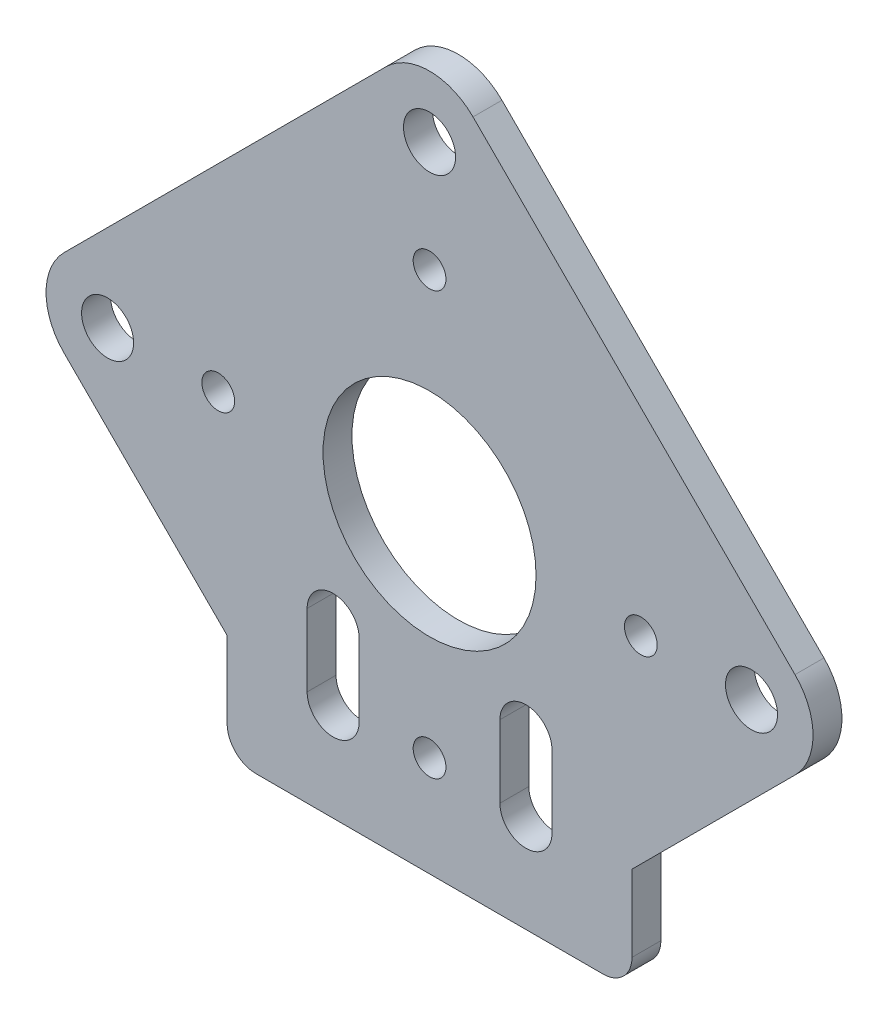
ISO-10303-21;
HEADER;
FILE_DESCRIPTION(('STEP AP214'),'2;1');
FILE_NAME('part.step','',(''),(''),'','','');
FILE_SCHEMA(('AUTOMOTIVE_DESIGN { 1 0 10303 214 1 1 1 1 }'));
ENDSEC;
DATA;
#1=APPLICATION_CONTEXT('core data for automotive mechanical design processes');
#2=APPLICATION_PROTOCOL_DEFINITION('international standard','automotive_design',2000,#1);
#3=PRODUCT_CONTEXT('',#1,'mechanical');
#4=PRODUCT('Part','Part','',(#3));
#5=PRODUCT_RELATED_PRODUCT_CATEGORY('part','',(#4));
#6=PRODUCT_DEFINITION_FORMATION('','',#4);
#7=PRODUCT_DEFINITION_CONTEXT('part definition',#1,'design');
#8=PRODUCT_DEFINITION('design','',#6,#7);
#9=PRODUCT_DEFINITION_SHAPE('','',#8);
#10=(LENGTH_UNIT() NAMED_UNIT(*) SI_UNIT(.MILLI.,.METRE.));
#11=(NAMED_UNIT(*) PLANE_ANGLE_UNIT() SI_UNIT($,.RADIAN.));
#12=(NAMED_UNIT(*) SI_UNIT($,.STERADIAN.) SOLID_ANGLE_UNIT());
#13=UNCERTAINTY_MEASURE_WITH_UNIT(LENGTH_MEASURE(1.E-05),#10,'distance_accuracy_value','');
#14=(GEOMETRIC_REPRESENTATION_CONTEXT(3) GLOBAL_UNCERTAINTY_ASSIGNED_CONTEXT((#13)) GLOBAL_UNIT_ASSIGNED_CONTEXT((#10,
#11,#12)) REPRESENTATION_CONTEXT('',''));
#15=CARTESIAN_POINT('',(0.,0.,0.));
#16=DIRECTION('',(0.,0.,1.));
#17=DIRECTION('',(1.,0.,0.));
#18=AXIS2_PLACEMENT_3D('',#15,#16,#17);
#19=CARTESIAN_POINT('',(73.4037243432525,32.3499999286518,3.));
#20=DIRECTION('',(0.,0.,1.));
#21=DIRECTION('',(1.,0.,0.));
#22=AXIS2_PLACEMENT_3D('',#19,#20,#21);
#23=PLANE('',#22);
#24=DIRECTION('',(0.,-1.,0.));
#25=VECTOR('',#24,1.);
#26=CARTESIAN_POINT('',(27.3,17.5,3.));
#27=LINE('',#26,#25);
#28=CARTESIAN_POINT('',(27.3,17.5,3.));
#29=VERTEX_POINT('',#28);
#30=CARTESIAN_POINT('',(27.3,10.,3.));
#31=VERTEX_POINT('',#30);
#32=EDGE_CURVE('E208',#29,#31,#27,.T.);
#33=ORIENTED_EDGE('',*,*,#32,.F.);
#34=CARTESIAN_POINT('',(30.,17.5,3.));
#35=DIRECTION('',(0.,0.,1.));
#36=DIRECTION('',(1.,0.,0.));
#37=AXIS2_PLACEMENT_3D('',#34,#35,#36);
#38=CIRCLE('',#37,2.7);
#39=CARTESIAN_POINT('',(32.7,17.5,3.));
#40=VERTEX_POINT('',#39);
#41=EDGE_CURVE('E206',#40,#29,#38,.T.);
#42=ORIENTED_EDGE('',*,*,#41,.F.);
#43=DIRECTION('',(0.,1.,0.));
#44=VECTOR('',#43,1.);
#45=CARTESIAN_POINT('',(32.7,10.,3.));
#46=LINE('',#45,#44);
#47=CARTESIAN_POINT('',(32.7,10.,3.));
#48=VERTEX_POINT('',#47);
#49=EDGE_CURVE('E214',#48,#40,#46,.T.);
#50=ORIENTED_EDGE('',*,*,#49,.F.);
#51=CARTESIAN_POINT('',(30.,10.,3.));
#52=DIRECTION('',(0.,0.,1.));
#53=DIRECTION('',(1.,0.,0.));
#54=AXIS2_PLACEMENT_3D('',#51,#52,#53);
#55=CIRCLE('',#54,2.7);
#56=EDGE_CURVE('E211',#31,#48,#55,.T.);
#57=ORIENTED_EDGE('',*,*,#56,.F.);
#58=EDGE_LOOP('',(#33,#42,#50,#57));
#59=FACE_BOUND('',#58,.T.);
#60=CARTESIAN_POINT('',(40.,65.75,3.));
#61=DIRECTION('',(0.,0.,1.));
#62=DIRECTION('',(1.,0.,0.));
#63=AXIS2_PLACEMENT_3D('',#60,#61,#62);
#64=CIRCLE('',#63,2.7);
#65=CARTESIAN_POINT('',(42.7,65.75,3.));
#66=VERTEX_POINT('',#65);
#67=EDGE_CURVE('E243',#66,#66,#64,.T.);
#68=ORIENTED_EDGE('',*,*,#67,.F.);
#69=EDGE_LOOP('',(#68));
#70=FACE_BOUND('',#69,.T.);
#71=CARTESIAN_POINT('',(40.,32.35,3.));
#72=DIRECTION('',(0.,0.,1.));
#73=DIRECTION('',(1.,0.,0.));
#74=AXIS2_PLACEMENT_3D('',#71,#72,#73);
#75=CIRCLE('',#74,11.05);
#76=CARTESIAN_POINT('',(51.05,32.35,3.));
#77=VERTEX_POINT('',#76);
#78=EDGE_CURVE('E255',#77,#77,#75,.T.);
#79=ORIENTED_EDGE('',*,*,#78,.F.);
#80=EDGE_LOOP('',(#79));
#81=FACE_BOUND('',#80,.T.);
#82=CARTESIAN_POINT('',(40.,54.270310216783,3.));
#83=DIRECTION('',(0.,0.,1.));
#84=DIRECTION('',(1.,0.,0.));
#85=AXIS2_PLACEMENT_3D('',#82,#83,#84);
#86=CIRCLE('',#85,1.7);
#87=CARTESIAN_POINT('',(41.7,54.270310216783,3.));
#88=VERTEX_POINT('',#87);
#89=EDGE_CURVE('E267',#88,#88,#86,.T.);
#90=ORIENTED_EDGE('',*,*,#89,.F.);
#91=EDGE_LOOP('',(#90));
#92=FACE_BOUND('',#91,.T.);
#93=CARTESIAN_POINT('',(40.,10.429689783217,3.));
#94=DIRECTION('',(0.,0.,1.));
#95=DIRECTION('',(1.,0.,0.));
#96=AXIS2_PLACEMENT_3D('',#93,#94,#95);
#97=CIRCLE('',#96,1.7);
#98=CARTESIAN_POINT('',(41.7,10.429689783217,3.));
#99=VERTEX_POINT('',#98);
#100=EDGE_CURVE('E279',#99,#99,#97,.T.);
#101=ORIENTED_EDGE('',*,*,#100,.F.);
#102=EDGE_LOOP('',(#101));
#103=FACE_BOUND('',#102,.T.);
#104=CARTESIAN_POINT('',(73.4037243432525,32.3499999286518,3.));
#105=DIRECTION('',(0.,0.,1.));
#106=DIRECTION('',(1.,0.,0.));
#107=AXIS2_PLACEMENT_3D('',#104,#105,#106);
#108=CIRCLE('',#107,6.37999999999999);
#109=CARTESIAN_POINT('',(77.9150656072226,27.8386586646816,3.));
#110=VERTEX_POINT('',#109);
#111=CARTESIAN_POINT('',(77.9150656072227,36.861341192622,3.));
#112=VERTEX_POINT('',#111);
#113=EDGE_CURVE('E285',#110,#112,#108,.T.);
#114=ORIENTED_EDGE('',*,*,#113,.T.);
#115=DIRECTION('',(-0.707106781043998,0.707106781329097,0.));
#116=VECTOR('',#115,1.);
#117=CARTESIAN_POINT('',(77.9150656072227,36.861341192622,3.));
#118=LINE('',#117,#116);
#119=CARTESIAN_POINT('',(44.5113412145794,70.2650655987333,3.));
#120=VERTEX_POINT('',#119);
#121=EDGE_CURVE('E288',#112,#120,#118,.T.);
#122=ORIENTED_EDGE('',*,*,#121,.T.);
#123=CARTESIAN_POINT('',(39.9999999463646,65.7537243390078,3.));
#124=DIRECTION('',(0.,0.,1.));
#125=DIRECTION('',(1.,0.,0.));
#126=AXIS2_PLACEMENT_3D('',#123,#124,#125);
#127=CIRCLE('',#126,6.38);
#128=CARTESIAN_POINT('',(35.4886586823944,70.265065602978,3.));
#129=VERTEX_POINT('',#128);
#130=EDGE_CURVE('E291',#120,#129,#127,.T.);
#131=ORIENTED_EDGE('',*,*,#130,.T.);
#132=DIRECTION('',(-0.707106780694885,-0.70710678167821,0.));
#133=VECTOR('',#132,1.);
#134=CARTESIAN_POINT('',(35.4886586823944,70.265065602978,3.));
#135=LINE('',#134,#133);
#136=CARTESIAN_POINT('',(2.08493438690051,36.8613412610318,3.));
#137=VERTEX_POINT('',#136);
#138=EDGE_CURVE('E293',#129,#137,#135,.T.);
#139=ORIENTED_EDGE('',*,*,#138,.T.);
#140=CARTESIAN_POINT('',(6.59627565380907,32.35,3.));
#141=DIRECTION('',(0.,0.,1.));
#142=DIRECTION('',(1.,0.,0.));
#143=AXIS2_PLACEMENT_3D('',#140,#141,#142);
#144=CIRCLE('',#143,6.38);
#145=CARTESIAN_POINT('',(2.0849343898389,27.8386587360298,3.));
#146=VERTEX_POINT('',#145);
#147=EDGE_CURVE('E295',#137,#146,#144,.T.);
#148=ORIENTED_EDGE('',*,*,#147,.T.);
#149=DIRECTION('',(0.707106781247965,-0.70710678112513,0.));
#150=VECTOR('',#149,1.);
#151=CARTESIAN_POINT('',(2.0849343898389,27.8386587360298,3.));
#152=LINE('',#151,#150);
#153=CARTESIAN_POINT('',(19.,10.9235931288071,3.));
#154=VERTEX_POINT('',#153);
#155=EDGE_CURVE('E297',#146,#154,#152,.T.);
#156=ORIENTED_EDGE('',*,*,#155,.T.);
#157=DIRECTION('',(0.,-1.,0.));
#158=VECTOR('',#157,1.);
#159=CARTESIAN_POINT('',(19.,10.9235931288071,3.));
#160=LINE('',#159,#158);
#161=CARTESIAN_POINT('',(19.,3.,3.));
#162=VERTEX_POINT('',#161);
#163=EDGE_CURVE('E299',#154,#162,#160,.T.);
#164=ORIENTED_EDGE('',*,*,#163,.T.);
#165=CARTESIAN_POINT('',(22.,3.,3.));
#166=DIRECTION('',(0.,0.,1.));
#167=DIRECTION('',(1.,0.,0.));
#168=AXIS2_PLACEMENT_3D('',#165,#166,#167);
#169=CIRCLE('',#168,3.);
#170=CARTESIAN_POINT('',(22.,0.,3.));
#171=VERTEX_POINT('',#170);
#172=EDGE_CURVE('E301',#162,#171,#169,.T.);
#173=ORIENTED_EDGE('',*,*,#172,.T.);
#174=DIRECTION('',(1.,0.,0.));
#175=VECTOR('',#174,1.);
#176=CARTESIAN_POINT('',(22.,0.,3.));
#177=LINE('',#176,#175);
#178=CARTESIAN_POINT('',(58.,0.,3.));
#179=VERTEX_POINT('',#178);
#180=EDGE_CURVE('E303',#171,#179,#177,.T.);
#181=ORIENTED_EDGE('',*,*,#180,.T.);
#182=CARTESIAN_POINT('',(58.,3.,3.));
#183=DIRECTION('',(0.,0.,1.));
#184=DIRECTION('',(1.,0.,0.));
#185=AXIS2_PLACEMENT_3D('',#182,#183,#184);
#186=CIRCLE('',#185,3.);
#187=CARTESIAN_POINT('',(61.,3.,3.));
#188=VERTEX_POINT('',#187);
#189=EDGE_CURVE('E305',#179,#188,#186,.T.);
#190=ORIENTED_EDGE('',*,*,#189,.T.);
#191=DIRECTION('',(0.,1.,0.));
#192=VECTOR('',#191,1.);
#193=CARTESIAN_POINT('',(61.,3.,3.));
#194=LINE('',#193,#192);
#195=CARTESIAN_POINT('',(61.,10.9235931288072,3.));
#196=VERTEX_POINT('',#195);
#197=EDGE_CURVE('E307',#188,#196,#194,.T.);
#198=ORIENTED_EDGE('',*,*,#197,.T.);
#199=DIRECTION('',(0.707106782677845,0.70710677969525,0.));
#200=VECTOR('',#199,1.);
#201=CARTESIAN_POINT('',(61.,10.9235931288072,3.));
#202=LINE('',#201,#200);
#203=EDGE_CURVE('E309',#196,#110,#202,.T.);
#204=ORIENTED_EDGE('',*,*,#203,.T.);
#205=EDGE_LOOP('',(#114,#122,#131,#139,#148,#156,#164,#173,#181,#190,#198,#204));
#206=FACE_BOUND('',#205,.T.);
#207=CARTESIAN_POINT('',(61.920310216783,32.35,3.));
#208=DIRECTION('',(0.,0.,1.));
#209=DIRECTION('',(1.,0.,0.));
#210=AXIS2_PLACEMENT_3D('',#207,#208,#209);
#211=CIRCLE('',#210,1.69999999999999);
#212=CARTESIAN_POINT('',(63.620310216783,32.35,3.));
#213=VERTEX_POINT('',#212);
#214=EDGE_CURVE('E273',#213,#213,#211,.T.);
#215=ORIENTED_EDGE('',*,*,#214,.F.);
#216=EDGE_LOOP('',(#215));
#217=FACE_BOUND('',#216,.T.);
#218=CARTESIAN_POINT('',(18.079689783217,32.35,3.));
#219=DIRECTION('',(0.,0.,1.));
#220=DIRECTION('',(1.,0.,0.));
#221=AXIS2_PLACEMENT_3D('',#218,#219,#220);
#222=CIRCLE('',#221,1.7);
#223=CARTESIAN_POINT('',(19.779689783217,32.35,3.));
#224=VERTEX_POINT('',#223);
#225=EDGE_CURVE('E261',#224,#224,#222,.T.);
#226=ORIENTED_EDGE('',*,*,#225,.F.);
#227=EDGE_LOOP('',(#226));
#228=FACE_BOUND('',#227,.T.);
#229=CARTESIAN_POINT('',(73.4,32.35,3.));
#230=DIRECTION('',(0.,0.,1.));
#231=DIRECTION('',(1.,0.,0.));
#232=AXIS2_PLACEMENT_3D('',#229,#230,#231);
#233=CIRCLE('',#232,2.69999999999999);
#234=CARTESIAN_POINT('',(76.1,32.35,3.));
#235=VERTEX_POINT('',#234);
#236=EDGE_CURVE('E249',#235,#235,#233,.T.);
#237=ORIENTED_EDGE('',*,*,#236,.F.);
#238=EDGE_LOOP('',(#237));
#239=FACE_BOUND('',#238,.T.);
#240=CARTESIAN_POINT('',(6.6,32.35,3.));
#241=DIRECTION('',(0.,0.,1.));
#242=DIRECTION('',(1.,0.,0.));
#243=AXIS2_PLACEMENT_3D('',#240,#241,#242);
#244=CIRCLE('',#243,2.7);
#245=CARTESIAN_POINT('',(9.3,32.35,3.));
#246=VERTEX_POINT('',#245);
#247=EDGE_CURVE('E237',#246,#246,#244,.T.);
#248=ORIENTED_EDGE('',*,*,#247,.F.);
#249=EDGE_LOOP('',(#248));
#250=FACE_BOUND('',#249,.T.);
#251=DIRECTION('',(0.,-1.,0.));
#252=VECTOR('',#251,1.);
#253=CARTESIAN_POINT('',(47.3,10.,3.));
#254=LINE('',#253,#252);
#255=CARTESIAN_POINT('',(47.3,17.5,3.));
#256=VERTEX_POINT('',#255);
#257=CARTESIAN_POINT('',(47.3,10.,3.));
#258=VERTEX_POINT('',#257);
#259=EDGE_CURVE('E178',#256,#258,#254,.T.);
#260=ORIENTED_EDGE('',*,*,#259,.F.);
#261=CARTESIAN_POINT('',(50.,17.5,3.));
#262=DIRECTION('',(0.,0.,1.));
#263=DIRECTION('',(1.,0.,0.));
#264=AXIS2_PLACEMENT_3D('',#261,#262,#263);
#265=CIRCLE('',#264,2.7);
#266=CARTESIAN_POINT('',(52.7,17.5,3.));
#267=VERTEX_POINT('',#266);
#268=EDGE_CURVE('E170',#267,#256,#265,.T.);
#269=ORIENTED_EDGE('',*,*,#268,.F.);
#270=DIRECTION('',(0.,1.,0.));
#271=VECTOR('',#270,1.);
#272=CARTESIAN_POINT('',(52.7,17.5,3.));
#273=LINE('',#272,#271);
#274=CARTESIAN_POINT('',(52.7,10.,3.));
#275=VERTEX_POINT('',#274);
#276=EDGE_CURVE('E192',#275,#267,#273,.T.);
#277=ORIENTED_EDGE('',*,*,#276,.F.);
#278=CARTESIAN_POINT('',(50.,10.,3.));
#279=DIRECTION('',(0.,0.,1.));
#280=DIRECTION('',(1.,0.,0.));
#281=AXIS2_PLACEMENT_3D('',#278,#279,#280);
#282=CIRCLE('',#281,2.7);
#283=EDGE_CURVE('E190',#258,#275,#282,.T.);
#284=ORIENTED_EDGE('',*,*,#283,.F.);
#285=EDGE_LOOP('',(#260,#269,#277,#284));
#286=FACE_BOUND('',#285,.T.);
#287=ADVANCED_FACE('F33',(#59,#70,#81,#92,#103,#206,#217,#228,#239,#250,#286),#23,.T.);
#288=CARTESIAN_POINT('',(73.4037243432525,32.3499999286518,0.));
#289=DIRECTION('',(0.,0.,1.));
#290=DIRECTION('',(1.,0.,0.));
#291=AXIS2_PLACEMENT_3D('',#288,#289,#290);
#292=PLANE('',#291);
#293=CARTESIAN_POINT('',(30.,17.5,0.));
#294=DIRECTION('',(0.,0.,1.));
#295=DIRECTION('',(1.,0.,0.));
#296=AXIS2_PLACEMENT_3D('',#293,#294,#295);
#297=CIRCLE('',#296,2.7);
#298=CARTESIAN_POINT('',(32.7,17.5,0.));
#299=VERTEX_POINT('',#298);
#300=CARTESIAN_POINT('',(27.3,17.5,0.));
#301=VERTEX_POINT('',#300);
#302=EDGE_CURVE('E186',#299,#301,#297,.T.);
#303=ORIENTED_EDGE('',*,*,#302,.T.);
#304=DIRECTION('',(0.,-1.,0.));
#305=VECTOR('',#304,1.);
#306=CARTESIAN_POINT('',(27.3,17.5,0.));
#307=LINE('',#306,#305);
#308=CARTESIAN_POINT('',(27.3,10.,0.));
#309=VERTEX_POINT('',#308);
#310=EDGE_CURVE('E219',#301,#309,#307,.T.);
#311=ORIENTED_EDGE('',*,*,#310,.T.);
#312=CARTESIAN_POINT('',(30.,10.,0.));
#313=DIRECTION('',(0.,0.,1.));
#314=DIRECTION('',(1.,0.,0.));
#315=AXIS2_PLACEMENT_3D('',#312,#313,#314);
#316=CIRCLE('',#315,2.7);
#317=CARTESIAN_POINT('',(32.7,10.,0.));
#318=VERTEX_POINT('',#317);
#319=EDGE_CURVE('E222',#309,#318,#316,.T.);
#320=ORIENTED_EDGE('',*,*,#319,.T.);
#321=DIRECTION('',(0.,1.,0.));
#322=VECTOR('',#321,1.);
#323=CARTESIAN_POINT('',(32.7,10.,0.));
#324=LINE('',#323,#322);
#325=EDGE_CURVE('E209',#318,#299,#324,.T.);
#326=ORIENTED_EDGE('',*,*,#325,.T.);
#327=EDGE_LOOP('',(#303,#311,#320,#326));
#328=FACE_BOUND('',#327,.T.);
#329=CARTESIAN_POINT('',(40.,65.75,0.));
#330=DIRECTION('',(0.,0.,1.));
#331=DIRECTION('',(1.,0.,0.));
#332=AXIS2_PLACEMENT_3D('',#329,#330,#331);
#333=CIRCLE('',#332,2.7);
#334=CARTESIAN_POINT('',(42.7,65.75,0.));
#335=VERTEX_POINT('',#334);
#336=EDGE_CURVE('E240',#335,#335,#333,.T.);
#337=ORIENTED_EDGE('',*,*,#336,.T.);
#338=EDGE_LOOP('',(#337));
#339=FACE_BOUND('',#338,.T.);
#340=CARTESIAN_POINT('',(40.,32.35,0.));
#341=DIRECTION('',(0.,0.,1.));
#342=DIRECTION('',(1.,0.,0.));
#343=AXIS2_PLACEMENT_3D('',#340,#341,#342);
#344=CIRCLE('',#343,11.05);
#345=CARTESIAN_POINT('',(51.05,32.35,0.));
#346=VERTEX_POINT('',#345);
#347=EDGE_CURVE('E252',#346,#346,#344,.T.);
#348=ORIENTED_EDGE('',*,*,#347,.T.);
#349=EDGE_LOOP('',(#348));
#350=FACE_BOUND('',#349,.T.);
#351=CARTESIAN_POINT('',(40.,54.270310216783,0.));
#352=DIRECTION('',(0.,0.,1.));
#353=DIRECTION('',(1.,0.,0.));
#354=AXIS2_PLACEMENT_3D('',#351,#352,#353);
#355=CIRCLE('',#354,1.7);
#356=CARTESIAN_POINT('',(41.7,54.270310216783,0.));
#357=VERTEX_POINT('',#356);
#358=EDGE_CURVE('E264',#357,#357,#355,.T.);
#359=ORIENTED_EDGE('',*,*,#358,.T.);
#360=EDGE_LOOP('',(#359));
#361=FACE_BOUND('',#360,.T.);
#362=CARTESIAN_POINT('',(40.,10.429689783217,0.));
#363=DIRECTION('',(0.,0.,1.));
#364=DIRECTION('',(1.,0.,0.));
#365=AXIS2_PLACEMENT_3D('',#362,#363,#364);
#366=CIRCLE('',#365,1.7);
#367=CARTESIAN_POINT('',(41.7,10.429689783217,0.));
#368=VERTEX_POINT('',#367);
#369=EDGE_CURVE('E276',#368,#368,#366,.T.);
#370=ORIENTED_EDGE('',*,*,#369,.T.);
#371=EDGE_LOOP('',(#370));
#372=FACE_BOUND('',#371,.T.);
#373=CARTESIAN_POINT('',(73.4037243432525,32.3499999286518,0.));
#374=DIRECTION('',(0.,0.,1.));
#375=DIRECTION('',(1.,0.,0.));
#376=AXIS2_PLACEMENT_3D('',#373,#374,#375);
#377=CIRCLE('',#376,6.37999999999999);
#378=CARTESIAN_POINT('',(77.9150656072226,27.8386586646816,0.));
#379=VERTEX_POINT('',#378);
#380=CARTESIAN_POINT('',(77.9150656072227,36.861341192622,0.));
#381=VERTEX_POINT('',#380);
#382=EDGE_CURVE('E282',#379,#381,#377,.T.);
#383=ORIENTED_EDGE('',*,*,#382,.F.);
#384=DIRECTION('',(0.707106782677845,0.70710677969525,0.));
#385=VECTOR('',#384,1.);
#386=CARTESIAN_POINT('',(61.,10.9235931288072,0.));
#387=LINE('',#386,#385);
#388=CARTESIAN_POINT('',(61.,10.9235931288072,0.));
#389=VERTEX_POINT('',#388);
#390=EDGE_CURVE('E289',#389,#379,#387,.T.);
#391=ORIENTED_EDGE('',*,*,#390,.F.);
#392=DIRECTION('',(0.,1.,0.));
#393=VECTOR('',#392,1.);
#394=CARTESIAN_POINT('',(61.,3.,0.));
#395=LINE('',#394,#393);
#396=CARTESIAN_POINT('',(61.,3.,0.));
#397=VERTEX_POINT('',#396);
#398=EDGE_CURVE('E332',#397,#389,#395,.T.);
#399=ORIENTED_EDGE('',*,*,#398,.F.);
#400=CARTESIAN_POINT('',(58.,3.,0.));
#401=DIRECTION('',(0.,0.,1.));
#402=DIRECTION('',(1.,0.,0.));
#403=AXIS2_PLACEMENT_3D('',#400,#401,#402);
#404=CIRCLE('',#403,3.);
#405=CARTESIAN_POINT('',(58.,0.,0.));
#406=VERTEX_POINT('',#405);
#407=EDGE_CURVE('E330',#406,#397,#404,.T.);
#408=ORIENTED_EDGE('',*,*,#407,.F.);
#409=DIRECTION('',(1.,0.,0.));
#410=VECTOR('',#409,1.);
#411=CARTESIAN_POINT('',(22.,0.,0.));
#412=LINE('',#411,#410);
#413=CARTESIAN_POINT('',(22.,0.,0.));
#414=VERTEX_POINT('',#413);
#415=EDGE_CURVE('E328',#414,#406,#412,.T.);
#416=ORIENTED_EDGE('',*,*,#415,.F.);
#417=CARTESIAN_POINT('',(22.,3.,0.));
#418=DIRECTION('',(0.,0.,1.));
#419=DIRECTION('',(1.,0.,0.));
#420=AXIS2_PLACEMENT_3D('',#417,#418,#419);
#421=CIRCLE('',#420,3.);
#422=CARTESIAN_POINT('',(19.,3.,0.));
#423=VERTEX_POINT('',#422);
#424=EDGE_CURVE('E326',#423,#414,#421,.T.);
#425=ORIENTED_EDGE('',*,*,#424,.F.);
#426=DIRECTION('',(0.,-1.,0.));
#427=VECTOR('',#426,1.);
#428=CARTESIAN_POINT('',(19.,10.9235931288071,0.));
#429=LINE('',#428,#427);
#430=CARTESIAN_POINT('',(19.,10.9235931288071,0.));
#431=VERTEX_POINT('',#430);
#432=EDGE_CURVE('E324',#431,#423,#429,.T.);
#433=ORIENTED_EDGE('',*,*,#432,.F.);
#434=DIRECTION('',(0.707106781247965,-0.70710678112513,0.));
#435=VECTOR('',#434,1.);
#436=CARTESIAN_POINT('',(2.0849343898389,27.8386587360298,0.));
#437=LINE('',#436,#435);
#438=CARTESIAN_POINT('',(2.0849343898389,27.8386587360298,0.));
#439=VERTEX_POINT('',#438);
#440=EDGE_CURVE('E322',#439,#431,#437,.T.);
#441=ORIENTED_EDGE('',*,*,#440,.F.);
#442=CARTESIAN_POINT('',(6.59627565380907,32.35,0.));
#443=DIRECTION('',(0.,0.,1.));
#444=DIRECTION('',(1.,0.,0.));
#445=AXIS2_PLACEMENT_3D('',#442,#443,#444);
#446=CIRCLE('',#445,6.38);
#447=CARTESIAN_POINT('',(2.08493438690051,36.8613412610318,0.));
#448=VERTEX_POINT('',#447);
#449=EDGE_CURVE('E320',#448,#439,#446,.T.);
#450=ORIENTED_EDGE('',*,*,#449,.F.);
#451=DIRECTION('',(-0.707106780694885,-0.70710678167821,0.));
#452=VECTOR('',#451,1.);
#453=CARTESIAN_POINT('',(35.4886586823944,70.265065602978,0.));
#454=LINE('',#453,#452);
#455=CARTESIAN_POINT('',(35.4886586823944,70.265065602978,0.));
#456=VERTEX_POINT('',#455);
#457=EDGE_CURVE('E318',#456,#448,#454,.T.);
#458=ORIENTED_EDGE('',*,*,#457,.F.);
#459=CARTESIAN_POINT('',(39.9999999463646,65.7537243390078,0.));
#460=DIRECTION('',(0.,0.,1.));
#461=DIRECTION('',(1.,0.,0.));
#462=AXIS2_PLACEMENT_3D('',#459,#460,#461);
#463=CIRCLE('',#462,6.38);
#464=CARTESIAN_POINT('',(44.5113412145794,70.2650655987333,0.));
#465=VERTEX_POINT('',#464);
#466=EDGE_CURVE('E316',#465,#456,#463,.T.);
#467=ORIENTED_EDGE('',*,*,#466,.F.);
#468=DIRECTION('',(-0.707106781043998,0.707106781329097,0.));
#469=VECTOR('',#468,1.);
#470=CARTESIAN_POINT('',(77.9150656072227,36.861341192622,0.));
#471=LINE('',#470,#469);
#472=EDGE_CURVE('E314',#381,#465,#471,.T.);
#473=ORIENTED_EDGE('',*,*,#472,.F.);
#474=EDGE_LOOP('',(#383,#391,#399,#408,#416,#425,#433,#441,#450,#458,#467,#473));
#475=FACE_BOUND('',#474,.T.);
#476=CARTESIAN_POINT('',(61.920310216783,32.35,0.));
#477=DIRECTION('',(0.,0.,1.));
#478=DIRECTION('',(1.,0.,0.));
#479=AXIS2_PLACEMENT_3D('',#476,#477,#478);
#480=CIRCLE('',#479,1.69999999999999);
#481=CARTESIAN_POINT('',(63.620310216783,32.35,0.));
#482=VERTEX_POINT('',#481);
#483=EDGE_CURVE('E270',#482,#482,#480,.T.);
#484=ORIENTED_EDGE('',*,*,#483,.T.);
#485=EDGE_LOOP('',(#484));
#486=FACE_BOUND('',#485,.T.);
#487=CARTESIAN_POINT('',(18.079689783217,32.35,0.));
#488=DIRECTION('',(0.,0.,1.));
#489=DIRECTION('',(1.,0.,0.));
#490=AXIS2_PLACEMENT_3D('',#487,#488,#489);
#491=CIRCLE('',#490,1.7);
#492=CARTESIAN_POINT('',(19.779689783217,32.35,0.));
#493=VERTEX_POINT('',#492);
#494=EDGE_CURVE('E258',#493,#493,#491,.T.);
#495=ORIENTED_EDGE('',*,*,#494,.T.);
#496=EDGE_LOOP('',(#495));
#497=FACE_BOUND('',#496,.T.);
#498=CARTESIAN_POINT('',(73.4,32.35,0.));
#499=DIRECTION('',(0.,0.,1.));
#500=DIRECTION('',(1.,0.,0.));
#501=AXIS2_PLACEMENT_3D('',#498,#499,#500);
#502=CIRCLE('',#501,2.69999999999999);
#503=CARTESIAN_POINT('',(76.1,32.35,0.));
#504=VERTEX_POINT('',#503);
#505=EDGE_CURVE('E246',#504,#504,#502,.T.);
#506=ORIENTED_EDGE('',*,*,#505,.T.);
#507=EDGE_LOOP('',(#506));
#508=FACE_BOUND('',#507,.T.);
#509=CARTESIAN_POINT('',(6.6,32.35,0.));
#510=DIRECTION('',(0.,0.,1.));
#511=DIRECTION('',(1.,0.,0.));
#512=AXIS2_PLACEMENT_3D('',#509,#510,#511);
#513=CIRCLE('',#512,2.7);
#514=CARTESIAN_POINT('',(9.3,32.35,0.));
#515=VERTEX_POINT('',#514);
#516=EDGE_CURVE('E236',#515,#515,#513,.T.);
#517=ORIENTED_EDGE('',*,*,#516,.T.);
#518=EDGE_LOOP('',(#517));
#519=FACE_BOUND('',#518,.T.);
#520=CARTESIAN_POINT('',(50.,17.5,0.));
#521=DIRECTION('',(0.,0.,1.));
#522=DIRECTION('',(1.,0.,0.));
#523=AXIS2_PLACEMENT_3D('',#520,#521,#522);
#524=CIRCLE('',#523,2.7);
#525=CARTESIAN_POINT('',(52.7,17.5,0.));
#526=VERTEX_POINT('',#525);
#527=CARTESIAN_POINT('',(47.3,17.5,0.));
#528=VERTEX_POINT('',#527);
#529=EDGE_CURVE('E56',#526,#528,#524,.T.);
#530=ORIENTED_EDGE('',*,*,#529,.T.);
#531=DIRECTION('',(0.,-1.,0.));
#532=VECTOR('',#531,1.);
#533=CARTESIAN_POINT('',(47.3,10.,0.));
#534=LINE('',#533,#532);
#535=CARTESIAN_POINT('',(47.3,10.,0.));
#536=VERTEX_POINT('',#535);
#537=EDGE_CURVE('E185',#528,#536,#534,.T.);
#538=ORIENTED_EDGE('',*,*,#537,.T.);
#539=CARTESIAN_POINT('',(50.,10.,0.));
#540=DIRECTION('',(0.,0.,1.));
#541=DIRECTION('',(1.,0.,0.));
#542=AXIS2_PLACEMENT_3D('',#539,#540,#541);
#543=CIRCLE('',#542,2.7);
#544=CARTESIAN_POINT('',(52.7,10.,0.));
#545=VERTEX_POINT('',#544);
#546=EDGE_CURVE('E198',#536,#545,#543,.T.);
#547=ORIENTED_EDGE('',*,*,#546,.T.);
#548=DIRECTION('',(0.,1.,0.));
#549=VECTOR('',#548,1.);
#550=CARTESIAN_POINT('',(52.7,17.5,0.));
#551=LINE('',#550,#549);
#552=EDGE_CURVE('E179',#545,#526,#551,.T.);
#553=ORIENTED_EDGE('',*,*,#552,.T.);
#554=EDGE_LOOP('',(#530,#538,#547,#553));
#555=FACE_BOUND('',#554,.T.);
#556=ADVANCED_FACE('F374',(#328,#339,#350,#361,#372,#475,#486,#497,#508,#519,#555),#292,.F.);
#557=CARTESIAN_POINT('',(73.4037243432525,32.3499999286518,3.));
#558=DIRECTION('',(0.,0.,-1.));
#559=DIRECTION('',(-1.,0.,0.));
#560=AXIS2_PLACEMENT_3D('',#557,#558,#559);
#561=CYLINDRICAL_SURFACE('',#560,6.37999999999999);
#562=ORIENTED_EDGE('',*,*,#382,.T.);
#563=DIRECTION('',(0.,0.,-1.));
#564=VECTOR('',#563,1.);
#565=CARTESIAN_POINT('',(77.9150656072227,36.861341192622,3.));
#566=LINE('',#565,#564);
#567=EDGE_CURVE('E11',#112,#381,#566,.T.);
#568=ORIENTED_EDGE('',*,*,#567,.F.);
#569=ORIENTED_EDGE('',*,*,#113,.F.);
#570=DIRECTION('',(0.,0.,-1.));
#571=VECTOR('',#570,1.);
#572=CARTESIAN_POINT('',(77.9150656072226,27.8386586646816,3.));
#573=LINE('',#572,#571);
#574=EDGE_CURVE('E311',#110,#379,#573,.T.);
#575=ORIENTED_EDGE('',*,*,#574,.T.);
#576=EDGE_LOOP('',(#562,#568,#569,#575));
#577=FACE_BOUND('',#576,.T.);
#578=ADVANCED_FACE('F35',(#577),#561,.T.);
#579=CARTESIAN_POINT('',(77.9150656072227,36.861341192622,3.));
#580=DIRECTION('',(-0.707106781329097,-0.707106781043998,0.));
#581=DIRECTION('',(0.707106781043998,-0.707106781329097,0.));
#582=AXIS2_PLACEMENT_3D('',#579,#580,#581);
#583=PLANE('',#582);
#584=ORIENTED_EDGE('',*,*,#472,.T.);
#585=DIRECTION('',(0.,0.,-1.));
#586=VECTOR('',#585,1.);
#587=CARTESIAN_POINT('',(44.5113412145794,70.2650655987333,3.));
#588=LINE('',#587,#586);
#589=EDGE_CURVE('E41',#120,#465,#588,.T.);
#590=ORIENTED_EDGE('',*,*,#589,.F.);
#591=ORIENTED_EDGE('',*,*,#121,.F.);
#592=ORIENTED_EDGE('',*,*,#567,.T.);
#593=EDGE_LOOP('',(#584,#590,#591,#592));
#594=FACE_BOUND('',#593,.T.);
#595=ADVANCED_FACE('F392',(#594),#583,.F.);
#596=CARTESIAN_POINT('',(39.9999999463646,65.7537243390078,3.));
#597=DIRECTION('',(0.,0.,-1.));
#598=DIRECTION('',(-1.,0.,0.));
#599=AXIS2_PLACEMENT_3D('',#596,#597,#598);
#600=CYLINDRICAL_SURFACE('',#599,6.38);
#601=ORIENTED_EDGE('',*,*,#466,.T.);
#602=DIRECTION('',(0.,0.,-1.));
#603=VECTOR('',#602,1.);
#604=CARTESIAN_POINT('',(35.4886586823944,70.265065602978,3.));
#605=LINE('',#604,#603);
#606=EDGE_CURVE('E361',#129,#456,#605,.T.);
#607=ORIENTED_EDGE('',*,*,#606,.F.);
#608=ORIENTED_EDGE('',*,*,#130,.F.);
#609=ORIENTED_EDGE('',*,*,#589,.T.);
#610=EDGE_LOOP('',(#601,#607,#608,#609));
#611=FACE_BOUND('',#610,.T.);
#612=ADVANCED_FACE('F368',(#611),#600,.T.);
#613=CARTESIAN_POINT('',(35.4886586823944,70.265065602978,3.));
#614=DIRECTION('',(0.70710678167821,-0.707106780694885,0.));
#615=DIRECTION('',(0.707106780694885,0.70710678167821,0.));
#616=AXIS2_PLACEMENT_3D('',#613,#614,#615);
#617=PLANE('',#616);
#618=ORIENTED_EDGE('',*,*,#457,.T.);
#619=DIRECTION('',(0.,0.,-1.));
#620=VECTOR('',#619,1.);
#621=CARTESIAN_POINT('',(2.08493438690051,36.8613412610318,3.));
#622=LINE('',#621,#620);
#623=EDGE_CURVE('E358',#137,#448,#622,.T.);
#624=ORIENTED_EDGE('',*,*,#623,.F.);
#625=ORIENTED_EDGE('',*,*,#138,.F.);
#626=ORIENTED_EDGE('',*,*,#606,.T.);
#627=EDGE_LOOP('',(#618,#624,#625,#626));
#628=FACE_BOUND('',#627,.T.);
#629=ADVANCED_FACE('F380',(#628),#617,.F.);
#630=CARTESIAN_POINT('',(6.59627565380907,32.35,3.));
#631=DIRECTION('',(0.,0.,-1.));
#632=DIRECTION('',(-1.,0.,0.));
#633=AXIS2_PLACEMENT_3D('',#630,#631,#632);
#634=CYLINDRICAL_SURFACE('',#633,6.38);
#635=ORIENTED_EDGE('',*,*,#449,.T.);
#636=DIRECTION('',(0.,0.,-1.));
#637=VECTOR('',#636,1.);
#638=CARTESIAN_POINT('',(2.0849343898389,27.8386587360298,3.));
#639=LINE('',#638,#637);
#640=EDGE_CURVE('E355',#146,#439,#639,.T.);
#641=ORIENTED_EDGE('',*,*,#640,.F.);
#642=ORIENTED_EDGE('',*,*,#147,.F.);
#643=ORIENTED_EDGE('',*,*,#623,.T.);
#644=EDGE_LOOP('',(#635,#641,#642,#643));
#645=FACE_BOUND('',#644,.T.);
#646=ADVANCED_FACE('F384',(#645),#634,.T.);
#647=CARTESIAN_POINT('',(2.0849343898389,27.8386587360298,3.));
#648=DIRECTION('',(0.70710678112513,0.707106781247965,0.));
#649=DIRECTION('',(-0.707106781247965,0.70710678112513,0.));
#650=AXIS2_PLACEMENT_3D('',#647,#648,#649);
#651=PLANE('',#650);
#652=ORIENTED_EDGE('',*,*,#440,.T.);
#653=DIRECTION('',(0.,0.,-1.));
#654=VECTOR('',#653,1.);
#655=CARTESIAN_POINT('',(19.,10.9235931288071,3.));
#656=LINE('',#655,#654);
#657=EDGE_CURVE('E352',#154,#431,#656,.T.);
#658=ORIENTED_EDGE('',*,*,#657,.F.);
#659=ORIENTED_EDGE('',*,*,#155,.F.);
#660=ORIENTED_EDGE('',*,*,#640,.T.);
#661=EDGE_LOOP('',(#652,#658,#659,#660));
#662=FACE_BOUND('',#661,.T.);
#663=ADVANCED_FACE('F425',(#662),#651,.F.);
#664=CARTESIAN_POINT('',(19.,10.9235931288071,3.));
#665=DIRECTION('',(1.,0.,0.));
#666=DIRECTION('',(0.,1.,0.));
#667=AXIS2_PLACEMENT_3D('',#664,#665,#666);
#668=PLANE('',#667);
#669=ORIENTED_EDGE('',*,*,#432,.T.);
#670=DIRECTION('',(0.,0.,-1.));
#671=VECTOR('',#670,1.);
#672=CARTESIAN_POINT('',(19.,3.,3.));
#673=LINE('',#672,#671);
#674=EDGE_CURVE('E349',#162,#423,#673,.T.);
#675=ORIENTED_EDGE('',*,*,#674,.F.);
#676=ORIENTED_EDGE('',*,*,#163,.F.);
#677=ORIENTED_EDGE('',*,*,#657,.T.);
#678=EDGE_LOOP('',(#669,#675,#676,#677));
#679=FACE_BOUND('',#678,.T.);
#680=ADVANCED_FACE('F423',(#679),#668,.F.);
#681=CARTESIAN_POINT('',(22.,3.,3.));
#682=DIRECTION('',(0.,0.,-1.));
#683=DIRECTION('',(-1.,0.,0.));
#684=AXIS2_PLACEMENT_3D('',#681,#682,#683);
#685=CYLINDRICAL_SURFACE('',#684,3.);
#686=ORIENTED_EDGE('',*,*,#424,.T.);
#687=DIRECTION('',(0.,0.,-1.));
#688=VECTOR('',#687,1.);
#689=CARTESIAN_POINT('',(22.,0.,3.));
#690=LINE('',#689,#688);
#691=EDGE_CURVE('E346',#171,#414,#690,.T.);
#692=ORIENTED_EDGE('',*,*,#691,.F.);
#693=ORIENTED_EDGE('',*,*,#172,.F.);
#694=ORIENTED_EDGE('',*,*,#674,.T.);
#695=EDGE_LOOP('',(#686,#692,#693,#694));
#696=FACE_BOUND('',#695,.T.);
#697=ADVANCED_FACE('F419',(#696),#685,.T.);
#698=CARTESIAN_POINT('',(22.,0.,3.));
#699=DIRECTION('',(0.,1.,0.));
#700=DIRECTION('',(0.,0.,1.));
#701=AXIS2_PLACEMENT_3D('',#698,#699,#700);
#702=PLANE('',#701);
#703=ORIENTED_EDGE('',*,*,#415,.T.);
#704=DIRECTION('',(0.,0.,-1.));
#705=VECTOR('',#704,1.);
#706=CARTESIAN_POINT('',(58.,0.,3.));
#707=LINE('',#706,#705);
#708=EDGE_CURVE('E343',#179,#406,#707,.T.);
#709=ORIENTED_EDGE('',*,*,#708,.F.);
#710=ORIENTED_EDGE('',*,*,#180,.F.);
#711=ORIENTED_EDGE('',*,*,#691,.T.);
#712=EDGE_LOOP('',(#703,#709,#710,#711));
#713=FACE_BOUND('',#712,.T.);
#714=ADVANCED_FACE('F414',(#713),#702,.F.);
#715=CARTESIAN_POINT('',(58.,3.,3.));
#716=DIRECTION('',(0.,0.,-1.));
#717=DIRECTION('',(-1.,0.,0.));
#718=AXIS2_PLACEMENT_3D('',#715,#716,#717);
#719=CYLINDRICAL_SURFACE('',#718,3.);
#720=ORIENTED_EDGE('',*,*,#407,.T.);
#721=DIRECTION('',(0.,0.,-1.));
#722=VECTOR('',#721,1.);
#723=CARTESIAN_POINT('',(61.,3.,3.));
#724=LINE('',#723,#722);
#725=EDGE_CURVE('E340',#188,#397,#724,.T.);
#726=ORIENTED_EDGE('',*,*,#725,.F.);
#727=ORIENTED_EDGE('',*,*,#189,.F.);
#728=ORIENTED_EDGE('',*,*,#708,.T.);
#729=EDGE_LOOP('',(#720,#726,#727,#728));
#730=FACE_BOUND('',#729,.T.);
#731=ADVANCED_FACE('F408',(#730),#719,.T.);
#732=CARTESIAN_POINT('',(61.,3.,3.));
#733=DIRECTION('',(-1.,0.,0.));
#734=DIRECTION('',(0.,0.,1.));
#735=AXIS2_PLACEMENT_3D('',#732,#733,#734);
#736=PLANE('',#735);
#737=ORIENTED_EDGE('',*,*,#398,.T.);
#738=DIRECTION('',(0.,0.,-1.));
#739=VECTOR('',#738,1.);
#740=CARTESIAN_POINT('',(61.,10.9235931288072,3.));
#741=LINE('',#740,#739);
#742=EDGE_CURVE('E337',#196,#389,#741,.T.);
#743=ORIENTED_EDGE('',*,*,#742,.F.);
#744=ORIENTED_EDGE('',*,*,#197,.F.);
#745=ORIENTED_EDGE('',*,*,#725,.T.);
#746=EDGE_LOOP('',(#737,#743,#744,#745));
#747=FACE_BOUND('',#746,.T.);
#748=ADVANCED_FACE('F404',(#747),#736,.F.);
#749=CARTESIAN_POINT('',(61.,10.9235931288072,3.));
#750=DIRECTION('',(-0.70710677969525,0.707106782677845,0.));
#751=DIRECTION('',(-0.707106782677845,-0.70710677969525,0.));
#752=AXIS2_PLACEMENT_3D('',#749,#750,#751);
#753=PLANE('',#752);
#754=ORIENTED_EDGE('',*,*,#390,.T.);
#755=ORIENTED_EDGE('',*,*,#574,.F.);
#756=ORIENTED_EDGE('',*,*,#203,.F.);
#757=ORIENTED_EDGE('',*,*,#742,.T.);
#758=EDGE_LOOP('',(#754,#755,#756,#757));
#759=FACE_BOUND('',#758,.T.);
#760=ADVANCED_FACE('F399',(#759),#753,.F.);
#761=CARTESIAN_POINT('',(40.,10.429689783217,3.));
#762=DIRECTION('',(0.,0.,-1.));
#763=DIRECTION('',(-1.,0.,0.));
#764=AXIS2_PLACEMENT_3D('',#761,#762,#763);
#765=CYLINDRICAL_SURFACE('',#764,1.7);
#766=ORIENTED_EDGE('',*,*,#100,.T.);
#767=EDGE_LOOP('',(#766));
#768=FACE_BOUND('',#767,.T.);
#769=ORIENTED_EDGE('',*,*,#369,.F.);
#770=EDGE_LOOP('',(#769));
#771=FACE_BOUND('',#770,.T.);
#772=ADVANCED_FACE('F445',(#768,#771),#765,.F.);
#773=CARTESIAN_POINT('',(61.920310216783,32.35,3.));
#774=DIRECTION('',(0.,0.,-1.));
#775=DIRECTION('',(-1.,0.,0.));
#776=AXIS2_PLACEMENT_3D('',#773,#774,#775);
#777=CYLINDRICAL_SURFACE('',#776,1.69999999999999);
#778=ORIENTED_EDGE('',*,*,#214,.T.);
#779=EDGE_LOOP('',(#778));
#780=FACE_BOUND('',#779,.T.);
#781=ORIENTED_EDGE('',*,*,#483,.F.);
#782=EDGE_LOOP('',(#781));
#783=FACE_BOUND('',#782,.T.);
#784=ADVANCED_FACE('F483',(#780,#783),#777,.F.);
#785=CARTESIAN_POINT('',(40.,54.270310216783,3.));
#786=DIRECTION('',(0.,0.,-1.));
#787=DIRECTION('',(-1.,0.,0.));
#788=AXIS2_PLACEMENT_3D('',#785,#786,#787);
#789=CYLINDRICAL_SURFACE('',#788,1.7);
#790=ORIENTED_EDGE('',*,*,#89,.T.);
#791=EDGE_LOOP('',(#790));
#792=FACE_BOUND('',#791,.T.);
#793=ORIENTED_EDGE('',*,*,#358,.F.);
#794=EDGE_LOOP('',(#793));
#795=FACE_BOUND('',#794,.T.);
#796=ADVANCED_FACE('F490',(#792,#795),#789,.F.);
#797=CARTESIAN_POINT('',(18.079689783217,32.35,3.));
#798=DIRECTION('',(0.,0.,-1.));
#799=DIRECTION('',(-1.,0.,0.));
#800=AXIS2_PLACEMENT_3D('',#797,#798,#799);
#801=CYLINDRICAL_SURFACE('',#800,1.7);
#802=ORIENTED_EDGE('',*,*,#225,.T.);
#803=EDGE_LOOP('',(#802));
#804=FACE_BOUND('',#803,.T.);
#805=ORIENTED_EDGE('',*,*,#494,.F.);
#806=EDGE_LOOP('',(#805));
#807=FACE_BOUND('',#806,.T.);
#808=ADVANCED_FACE('F497',(#804,#807),#801,.F.);
#809=CARTESIAN_POINT('',(40.,32.35,3.));
#810=DIRECTION('',(0.,0.,-1.));
#811=DIRECTION('',(-1.,0.,0.));
#812=AXIS2_PLACEMENT_3D('',#809,#810,#811);
#813=CYLINDRICAL_SURFACE('',#812,11.05);
#814=ORIENTED_EDGE('',*,*,#78,.T.);
#815=EDGE_LOOP('',(#814));
#816=FACE_BOUND('',#815,.T.);
#817=ORIENTED_EDGE('',*,*,#347,.F.);
#818=EDGE_LOOP('',(#817));
#819=FACE_BOUND('',#818,.T.);
#820=ADVANCED_FACE('F505',(#816,#819),#813,.F.);
#821=CARTESIAN_POINT('',(73.4,32.35,3.));
#822=DIRECTION('',(0.,0.,-1.));
#823=DIRECTION('',(-1.,0.,0.));
#824=AXIS2_PLACEMENT_3D('',#821,#822,#823);
#825=CYLINDRICAL_SURFACE('',#824,2.69999999999999);
#826=ORIENTED_EDGE('',*,*,#236,.T.);
#827=EDGE_LOOP('',(#826));
#828=FACE_BOUND('',#827,.T.);
#829=ORIENTED_EDGE('',*,*,#505,.F.);
#830=EDGE_LOOP('',(#829));
#831=FACE_BOUND('',#830,.T.);
#832=ADVANCED_FACE('F513',(#828,#831),#825,.F.);
#833=CARTESIAN_POINT('',(40.,65.75,3.));
#834=DIRECTION('',(0.,0.,-1.));
#835=DIRECTION('',(-1.,0.,0.));
#836=AXIS2_PLACEMENT_3D('',#833,#834,#835);
#837=CYLINDRICAL_SURFACE('',#836,2.7);
#838=ORIENTED_EDGE('',*,*,#67,.T.);
#839=EDGE_LOOP('',(#838));
#840=FACE_BOUND('',#839,.T.);
#841=ORIENTED_EDGE('',*,*,#336,.F.);
#842=EDGE_LOOP('',(#841));
#843=FACE_BOUND('',#842,.T.);
#844=ADVANCED_FACE('F521',(#840,#843),#837,.F.);
#845=CARTESIAN_POINT('',(6.6,32.35,3.));
#846=DIRECTION('',(0.,0.,-1.));
#847=DIRECTION('',(-1.,0.,0.));
#848=AXIS2_PLACEMENT_3D('',#845,#846,#847);
#849=CYLINDRICAL_SURFACE('',#848,2.7);
#850=ORIENTED_EDGE('',*,*,#247,.T.);
#851=EDGE_LOOP('',(#850));
#852=FACE_BOUND('',#851,.T.);
#853=ORIENTED_EDGE('',*,*,#516,.F.);
#854=EDGE_LOOP('',(#853));
#855=FACE_BOUND('',#854,.T.);
#856=ADVANCED_FACE('F529',(#852,#855),#849,.F.);
#857=CARTESIAN_POINT('',(30.,17.5,3.));
#858=DIRECTION('',(0.,0.,-1.));
#859=DIRECTION('',(-1.,0.,0.));
#860=AXIS2_PLACEMENT_3D('',#857,#858,#859);
#861=CYLINDRICAL_SURFACE('',#860,2.7);
#862=ORIENTED_EDGE('',*,*,#302,.F.);
#863=DIRECTION('',(0.,0.,-1.));
#864=VECTOR('',#863,1.);
#865=CARTESIAN_POINT('',(32.7,17.5,3.));
#866=LINE('',#865,#864);
#867=EDGE_CURVE('E216',#40,#299,#866,.T.);
#868=ORIENTED_EDGE('',*,*,#867,.F.);
#869=ORIENTED_EDGE('',*,*,#41,.T.);
#870=DIRECTION('',(0.,0.,-1.));
#871=VECTOR('',#870,1.);
#872=CARTESIAN_POINT('',(27.3,17.5,3.));
#873=LINE('',#872,#871);
#874=EDGE_CURVE('E233',#29,#301,#873,.T.);
#875=ORIENTED_EDGE('',*,*,#874,.T.);
#876=EDGE_LOOP('',(#862,#868,#869,#875));
#877=FACE_BOUND('',#876,.T.);
#878=ADVANCED_FACE('F537',(#877),#861,.F.);
#879=CARTESIAN_POINT('',(27.3,17.5,3.));
#880=DIRECTION('',(1.,0.,0.));
#881=DIRECTION('',(0.,1.,0.));
#882=AXIS2_PLACEMENT_3D('',#879,#880,#881);
#883=PLANE('',#882);
#884=ORIENTED_EDGE('',*,*,#310,.F.);
#885=ORIENTED_EDGE('',*,*,#874,.F.);
#886=ORIENTED_EDGE('',*,*,#32,.T.);
#887=DIRECTION('',(0.,0.,-1.));
#888=VECTOR('',#887,1.);
#889=CARTESIAN_POINT('',(27.3,10.,3.));
#890=LINE('',#889,#888);
#891=EDGE_CURVE('E231',#31,#309,#890,.T.);
#892=ORIENTED_EDGE('',*,*,#891,.T.);
#893=EDGE_LOOP('',(#884,#885,#886,#892));
#894=FACE_BOUND('',#893,.T.);
#895=ADVANCED_FACE('F545',(#894),#883,.T.);
#896=CARTESIAN_POINT('',(30.,10.,3.));
#897=DIRECTION('',(0.,0.,-1.));
#898=DIRECTION('',(-1.,0.,0.));
#899=AXIS2_PLACEMENT_3D('',#896,#897,#898);
#900=CYLINDRICAL_SURFACE('',#899,2.7);
#901=ORIENTED_EDGE('',*,*,#319,.F.);
#902=ORIENTED_EDGE('',*,*,#891,.F.);
#903=ORIENTED_EDGE('',*,*,#56,.T.);
#904=DIRECTION('',(0.,0.,-1.));
#905=VECTOR('',#904,1.);
#906=CARTESIAN_POINT('',(32.7,10.,3.));
#907=LINE('',#906,#905);
#908=EDGE_CURVE('E229',#48,#318,#907,.T.);
#909=ORIENTED_EDGE('',*,*,#908,.T.);
#910=EDGE_LOOP('',(#901,#902,#903,#909));
#911=FACE_BOUND('',#910,.T.);
#912=ADVANCED_FACE('F553',(#911),#900,.F.);
#913=CARTESIAN_POINT('',(32.7,10.,3.));
#914=DIRECTION('',(-1.,0.,0.));
#915=DIRECTION('',(0.,0.,1.));
#916=AXIS2_PLACEMENT_3D('',#913,#914,#915);
#917=PLANE('',#916);
#918=ORIENTED_EDGE('',*,*,#325,.F.);
#919=ORIENTED_EDGE('',*,*,#908,.F.);
#920=ORIENTED_EDGE('',*,*,#49,.T.);
#921=ORIENTED_EDGE('',*,*,#867,.T.);
#922=EDGE_LOOP('',(#918,#919,#920,#921));
#923=FACE_BOUND('',#922,.T.);
#924=ADVANCED_FACE('F561',(#923),#917,.T.);
#925=CARTESIAN_POINT('',(50.,17.5,3.));
#926=DIRECTION('',(0.,0.,-1.));
#927=DIRECTION('',(-1.,0.,0.));
#928=AXIS2_PLACEMENT_3D('',#925,#926,#927);
#929=CYLINDRICAL_SURFACE('',#928,2.7);
#930=ORIENTED_EDGE('',*,*,#529,.F.);
#931=DIRECTION('',(0.,0.,-1.));
#932=VECTOR('',#931,1.);
#933=CARTESIAN_POINT('',(52.7,17.5,3.));
#934=LINE('',#933,#932);
#935=EDGE_CURVE('E174',#267,#526,#934,.T.);
#936=ORIENTED_EDGE('',*,*,#935,.F.);
#937=ORIENTED_EDGE('',*,*,#268,.T.);
#938=DIRECTION('',(0.,0.,-1.));
#939=VECTOR('',#938,1.);
#940=CARTESIAN_POINT('',(47.3,17.5,3.));
#941=LINE('',#940,#939);
#942=EDGE_CURVE('E173',#256,#528,#941,.T.);
#943=ORIENTED_EDGE('',*,*,#942,.T.);
#944=EDGE_LOOP('',(#930,#936,#937,#943));
#945=FACE_BOUND('',#944,.T.);
#946=ADVANCED_FACE('F172',(#945),#929,.F.);
#947=CARTESIAN_POINT('',(47.3,10.,3.));
#948=DIRECTION('',(1.,0.,0.));
#949=DIRECTION('',(0.,0.,-1.));
#950=AXIS2_PLACEMENT_3D('',#947,#948,#949);
#951=PLANE('',#950);
#952=ORIENTED_EDGE('',*,*,#537,.F.);
#953=ORIENTED_EDGE('',*,*,#942,.F.);
#954=ORIENTED_EDGE('',*,*,#259,.T.);
#955=DIRECTION('',(0.,0.,-1.));
#956=VECTOR('',#955,1.);
#957=CARTESIAN_POINT('',(47.3,10.,3.));
#958=LINE('',#957,#956);
#959=EDGE_CURVE('E187',#258,#536,#958,.T.);
#960=ORIENTED_EDGE('',*,*,#959,.T.);
#961=EDGE_LOOP('',(#952,#953,#954,#960));
#962=FACE_BOUND('',#961,.T.);
#963=ADVANCED_FACE('F182',(#962),#951,.T.);
#964=CARTESIAN_POINT('',(50.,10.,3.));
#965=DIRECTION('',(0.,0.,-1.));
#966=DIRECTION('',(-1.,0.,0.));
#967=AXIS2_PLACEMENT_3D('',#964,#965,#966);
#968=CYLINDRICAL_SURFACE('',#967,2.7);
#969=ORIENTED_EDGE('',*,*,#546,.F.);
#970=ORIENTED_EDGE('',*,*,#959,.F.);
#971=ORIENTED_EDGE('',*,*,#283,.T.);
#972=DIRECTION('',(0.,0.,-1.));
#973=VECTOR('',#972,1.);
#974=CARTESIAN_POINT('',(52.7,10.,3.));
#975=LINE('',#974,#973);
#976=EDGE_CURVE('E48',#275,#545,#975,.T.);
#977=ORIENTED_EDGE('',*,*,#976,.T.);
#978=EDGE_LOOP('',(#969,#970,#971,#977));
#979=FACE_BOUND('',#978,.T.);
#980=ADVANCED_FACE('F582',(#979),#968,.F.);
#981=CARTESIAN_POINT('',(52.7,17.5,3.));
#982=DIRECTION('',(-1.,0.,0.));
#983=DIRECTION('',(0.,-1.,0.));
#984=AXIS2_PLACEMENT_3D('',#981,#982,#983);
#985=PLANE('',#984);
#986=ORIENTED_EDGE('',*,*,#552,.F.);
#987=ORIENTED_EDGE('',*,*,#976,.F.);
#988=ORIENTED_EDGE('',*,*,#276,.T.);
#989=ORIENTED_EDGE('',*,*,#935,.T.);
#990=EDGE_LOOP('',(#986,#987,#988,#989));
#991=FACE_BOUND('',#990,.T.);
#992=ADVANCED_FACE('F589',(#991),#985,.T.);
#993=CLOSED_SHELL('',(#287,#556,#578,#595,#612,#629,#646,#663,#680,#697,#714,#731,#748,#760,
#772,#784,#796,#808,#820,#832,#844,#856,#878,#895,#912,#924,#946,#963,#980,#992));
#994=MANIFOLD_SOLID_BREP('B2',#993);
#995=ADVANCED_BREP_SHAPE_REPRESENTATION('',(#18,#994),#14);
#996=SHAPE_DEFINITION_REPRESENTATION(#9,#995);
ENDSEC;
END-ISO-10303-21;
